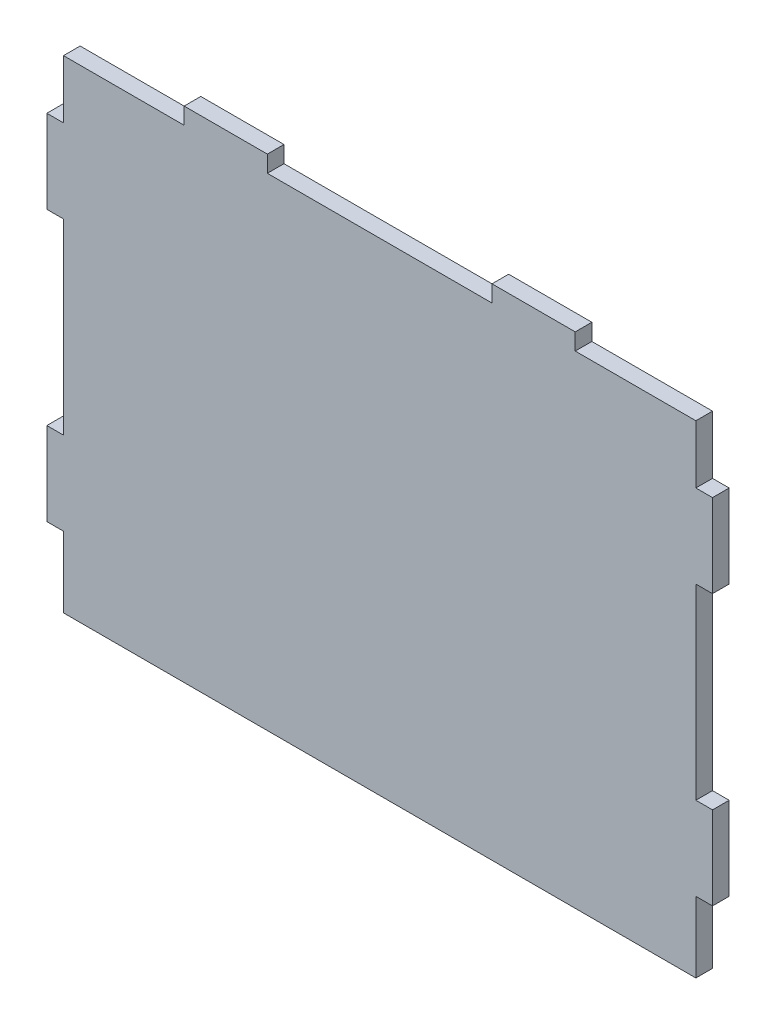
ISO-10303-21;
HEADER;
FILE_DESCRIPTION(('STEP AP214'),'2;1');
FILE_NAME('part.step','',(''),(''),'','','');
FILE_SCHEMA(('AUTOMOTIVE_DESIGN { 1 0 10303 214 1 1 1 1 }'));
ENDSEC;
DATA;
#1=APPLICATION_CONTEXT('core data for automotive mechanical design processes');
#2=APPLICATION_PROTOCOL_DEFINITION('international standard','automotive_design',2000,#1);
#3=PRODUCT_CONTEXT('',#1,'mechanical');
#4=PRODUCT('Part','Part','',(#3));
#5=PRODUCT_RELATED_PRODUCT_CATEGORY('part','',(#4));
#6=PRODUCT_DEFINITION_FORMATION('','',#4);
#7=PRODUCT_DEFINITION_CONTEXT('part definition',#1,'design');
#8=PRODUCT_DEFINITION('design','',#6,#7);
#9=PRODUCT_DEFINITION_SHAPE('','',#8);
#10=(LENGTH_UNIT() NAMED_UNIT(*) SI_UNIT(.MILLI.,.METRE.));
#11=(NAMED_UNIT(*) PLANE_ANGLE_UNIT() SI_UNIT($,.RADIAN.));
#12=(NAMED_UNIT(*) SI_UNIT($,.STERADIAN.) SOLID_ANGLE_UNIT());
#13=UNCERTAINTY_MEASURE_WITH_UNIT(LENGTH_MEASURE(1.E-05),#10,'distance_accuracy_value','');
#14=(GEOMETRIC_REPRESENTATION_CONTEXT(3) GLOBAL_UNCERTAINTY_ASSIGNED_CONTEXT((#13)) GLOBAL_UNIT_ASSIGNED_CONTEXT((#10,
#11,#12)) REPRESENTATION_CONTEXT('',''));
#15=CARTESIAN_POINT('',(0.,0.,0.));
#16=DIRECTION('',(0.,0.,1.));
#17=DIRECTION('',(1.,0.,0.));
#18=AXIS2_PLACEMENT_3D('',#15,#16,#17);
#19=CARTESIAN_POINT('',(96.5200000000001,0.,5.08));
#20=DIRECTION('',(1.,0.,0.));
#21=DIRECTION('',(0.,1.,0.));
#22=AXIS2_PLACEMENT_3D('',#19,#20,#21);
#23=PLANE('',#22);
#24=DIRECTION('',(0.,-1.,0.));
#25=VECTOR('',#24,1.);
#26=CARTESIAN_POINT('',(96.5200000000001,0.,0.));
#27=LINE('',#26,#25);
#28=CARTESIAN_POINT('',(96.52,96.5200000000001,0.));
#29=VERTEX_POINT('',#28);
#30=CARTESIAN_POINT('',(96.52,78.74,0.));
#31=VERTEX_POINT('',#30);
#32=EDGE_CURVE('E247',#29,#31,#27,.T.);
#33=ORIENTED_EDGE('',*,*,#32,.F.);
#34=DIRECTION('',(0.,0.,-1.));
#35=VECTOR('',#34,1.);
#36=CARTESIAN_POINT('',(96.52,96.5200000000001,5.08));
#37=LINE('',#36,#35);
#38=CARTESIAN_POINT('',(96.52,96.5200000000001,5.08));
#39=VERTEX_POINT('',#38);
#40=EDGE_CURVE('E11',#39,#29,#37,.T.);
#41=ORIENTED_EDGE('',*,*,#40,.F.);
#42=DIRECTION('',(0.,-1.,0.));
#43=VECTOR('',#42,1.);
#44=CARTESIAN_POINT('',(96.5200000000001,0.,5.08));
#45=LINE('',#44,#43);
#46=CARTESIAN_POINT('',(96.52,78.74,5.08));
#47=VERTEX_POINT('',#46);
#48=EDGE_CURVE('E313',#39,#47,#45,.T.);
#49=ORIENTED_EDGE('',*,*,#48,.T.);
#50=DIRECTION('',(0.,0.,-1.));
#51=VECTOR('',#50,1.);
#52=CARTESIAN_POINT('',(96.52,78.74,5.08));
#53=LINE('',#52,#51);
#54=EDGE_CURVE('E145',#47,#31,#53,.T.);
#55=ORIENTED_EDGE('',*,*,#54,.T.);
#56=EDGE_LOOP('',(#33,#41,#49,#55));
#57=FACE_BOUND('',#56,.T.);
#58=ADVANCED_FACE('F34',(#57),#23,.T.);
#59=CARTESIAN_POINT('',(0.,96.5200000000001,5.08));
#60=DIRECTION('',(0.,1.,0.));
#61=DIRECTION('',(-1.,0.,0.));
#62=AXIS2_PLACEMENT_3D('',#59,#60,#61);
#63=PLANE('',#62);
#64=DIRECTION('',(1.,0.,0.));
#65=VECTOR('',#64,1.);
#66=CARTESIAN_POINT('',(0.,96.5200000000001,0.));
#67=LINE('',#66,#65);
#68=CARTESIAN_POINT('',(59.69,96.5200000000001,0.));
#69=VERTEX_POINT('',#68);
#70=EDGE_CURVE('E250',#69,#29,#67,.T.);
#71=ORIENTED_EDGE('',*,*,#70,.F.);
#72=DIRECTION('',(0.,0.,-1.));
#73=VECTOR('',#72,1.);
#74=CARTESIAN_POINT('',(59.69,96.5200000000001,5.08));
#75=LINE('',#74,#73);
#76=CARTESIAN_POINT('',(59.69,96.5200000000001,5.08));
#77=VERTEX_POINT('',#76);
#78=EDGE_CURVE('E43',#77,#69,#75,.T.);
#79=ORIENTED_EDGE('',*,*,#78,.F.);
#80=DIRECTION('',(1.,0.,0.));
#81=VECTOR('',#80,1.);
#82=CARTESIAN_POINT('',(0.,96.5200000000001,5.08));
#83=LINE('',#82,#81);
#84=EDGE_CURVE('E384',#77,#39,#83,.T.);
#85=ORIENTED_EDGE('',*,*,#84,.T.);
#86=ORIENTED_EDGE('',*,*,#40,.T.);
#87=EDGE_LOOP('',(#71,#79,#85,#86));
#88=FACE_BOUND('',#87,.T.);
#89=ADVANCED_FACE('F372',(#88),#63,.T.);
#90=CARTESIAN_POINT('',(59.69,0.,5.08));
#91=DIRECTION('',(1.,0.,0.));
#92=DIRECTION('',(0.,0.,-1.));
#93=AXIS2_PLACEMENT_3D('',#90,#91,#92);
#94=PLANE('',#93);
#95=DIRECTION('',(0.,-1.,0.));
#96=VECTOR('',#95,1.);
#97=CARTESIAN_POINT('',(59.69,0.,0.));
#98=LINE('',#97,#96);
#99=CARTESIAN_POINT('',(59.69,101.6,0.));
#100=VERTEX_POINT('',#99);
#101=EDGE_CURVE('E255',#100,#69,#98,.T.);
#102=ORIENTED_EDGE('',*,*,#101,.F.);
#103=DIRECTION('',(0.,0.,-1.));
#104=VECTOR('',#103,1.);
#105=CARTESIAN_POINT('',(59.69,101.6,5.08));
#106=LINE('',#105,#104);
#107=CARTESIAN_POINT('',(59.69,101.6,5.08));
#108=VERTEX_POINT('',#107);
#109=EDGE_CURVE('E362',#108,#100,#106,.T.);
#110=ORIENTED_EDGE('',*,*,#109,.F.);
#111=DIRECTION('',(0.,-1.,0.));
#112=VECTOR('',#111,1.);
#113=CARTESIAN_POINT('',(59.69,0.,5.08));
#114=LINE('',#113,#112);
#115=EDGE_CURVE('E368',#108,#77,#114,.T.);
#116=ORIENTED_EDGE('',*,*,#115,.T.);
#117=ORIENTED_EDGE('',*,*,#78,.T.);
#118=EDGE_LOOP('',(#102,#110,#116,#117));
#119=FACE_BOUND('',#118,.T.);
#120=ADVANCED_FACE('F36',(#119),#94,.T.);
#121=CARTESIAN_POINT('',(0.,101.6,5.08));
#122=DIRECTION('',(0.,1.,0.));
#123=DIRECTION('',(0.,0.,1.));
#124=AXIS2_PLACEMENT_3D('',#121,#122,#123);
#125=PLANE('',#124);
#126=DIRECTION('',(1.,0.,0.));
#127=VECTOR('',#126,1.);
#128=CARTESIAN_POINT('',(0.,101.6,0.));
#129=LINE('',#128,#127);
#130=CARTESIAN_POINT('',(34.29,101.6,0.));
#131=VERTEX_POINT('',#130);
#132=EDGE_CURVE('E260',#131,#100,#129,.T.);
#133=ORIENTED_EDGE('',*,*,#132,.F.);
#134=DIRECTION('',(0.,0.,-1.));
#135=VECTOR('',#134,1.);
#136=CARTESIAN_POINT('',(34.29,101.6,5.08));
#137=LINE('',#136,#135);
#138=CARTESIAN_POINT('',(34.29,101.6,5.08));
#139=VERTEX_POINT('',#138);
#140=EDGE_CURVE('E360',#139,#131,#137,.T.);
#141=ORIENTED_EDGE('',*,*,#140,.F.);
#142=DIRECTION('',(1.,0.,0.));
#143=VECTOR('',#142,1.);
#144=CARTESIAN_POINT('',(0.,101.6,5.08));
#145=LINE('',#144,#143);
#146=EDGE_CURVE('E383',#139,#108,#145,.T.);
#147=ORIENTED_EDGE('',*,*,#146,.T.);
#148=ORIENTED_EDGE('',*,*,#109,.T.);
#149=EDGE_LOOP('',(#133,#141,#147,#148));
#150=FACE_BOUND('',#149,.T.);
#151=ADVANCED_FACE('F379',(#150),#125,.T.);
#152=CARTESIAN_POINT('',(34.29,0.,5.08));
#153=DIRECTION('',(1.,0.,0.));
#154=DIRECTION('',(0.,0.,-1.));
#155=AXIS2_PLACEMENT_3D('',#152,#153,#154);
#156=PLANE('',#155);
#157=DIRECTION('',(0.,-1.,0.));
#158=VECTOR('',#157,1.);
#159=CARTESIAN_POINT('',(34.29,0.,0.));
#160=LINE('',#159,#158);
#161=CARTESIAN_POINT('',(34.29,96.5200000000001,0.));
#162=VERTEX_POINT('',#161);
#163=EDGE_CURVE('E263',#131,#162,#160,.T.);
#164=ORIENTED_EDGE('',*,*,#163,.T.);
#165=DIRECTION('',(0.,0.,-1.));
#166=VECTOR('',#165,1.);
#167=CARTESIAN_POINT('',(34.29,96.5200000000001,5.08));
#168=LINE('',#167,#166);
#169=CARTESIAN_POINT('',(34.29,96.5200000000001,5.08));
#170=VERTEX_POINT('',#169);
#171=EDGE_CURVE('E358',#170,#162,#168,.T.);
#172=ORIENTED_EDGE('',*,*,#171,.F.);
#173=DIRECTION('',(0.,-1.,0.));
#174=VECTOR('',#173,1.);
#175=CARTESIAN_POINT('',(34.29,0.,5.08));
#176=LINE('',#175,#174);
#177=EDGE_CURVE('E386',#139,#170,#176,.T.);
#178=ORIENTED_EDGE('',*,*,#177,.F.);
#179=ORIENTED_EDGE('',*,*,#140,.T.);
#180=EDGE_LOOP('',(#164,#172,#178,#179));
#181=FACE_BOUND('',#180,.T.);
#182=ADVANCED_FACE('F689',(#181),#156,.F.);
#183=CARTESIAN_POINT('',(-34.29,96.5200000000001,0.));
#184=VERTEX_POINT('',#183);
#185=EDGE_CURVE('E257',#184,#162,#67,.T.);
#186=ORIENTED_EDGE('',*,*,#185,.F.);
#187=DIRECTION('',(0.,0.,-1.));
#188=VECTOR('',#187,1.);
#189=CARTESIAN_POINT('',(-34.29,96.5200000000001,5.08));
#190=LINE('',#189,#188);
#191=CARTESIAN_POINT('',(-34.29,96.5200000000001,5.08));
#192=VERTEX_POINT('',#191);
#193=EDGE_CURVE('E356',#192,#184,#190,.T.);
#194=ORIENTED_EDGE('',*,*,#193,.F.);
#195=EDGE_CURVE('E390',#192,#170,#83,.T.);
#196=ORIENTED_EDGE('',*,*,#195,.T.);
#197=ORIENTED_EDGE('',*,*,#171,.T.);
#198=EDGE_LOOP('',(#186,#194,#196,#197));
#199=FACE_BOUND('',#198,.T.);
#200=ADVANCED_FACE('F444',(#199),#63,.T.);
#201=CARTESIAN_POINT('',(-34.29,0.,5.08));
#202=DIRECTION('',(1.,0.,0.));
#203=DIRECTION('',(0.,0.,-1.));
#204=AXIS2_PLACEMENT_3D('',#201,#202,#203);
#205=PLANE('',#204);
#206=DIRECTION('',(0.,-1.,0.));
#207=VECTOR('',#206,1.);
#208=CARTESIAN_POINT('',(-34.29,0.,0.));
#209=LINE('',#208,#207);
#210=CARTESIAN_POINT('',(-34.29,101.6,0.));
#211=VERTEX_POINT('',#210);
#212=EDGE_CURVE('E266',#211,#184,#209,.T.);
#213=ORIENTED_EDGE('',*,*,#212,.F.);
#214=DIRECTION('',(0.,0.,-1.));
#215=VECTOR('',#214,1.);
#216=CARTESIAN_POINT('',(-34.29,101.6,5.08));
#217=LINE('',#216,#215);
#218=CARTESIAN_POINT('',(-34.29,101.6,5.08));
#219=VERTEX_POINT('',#218);
#220=EDGE_CURVE('E354',#219,#211,#217,.T.);
#221=ORIENTED_EDGE('',*,*,#220,.F.);
#222=DIRECTION('',(0.,-1.,0.));
#223=VECTOR('',#222,1.);
#224=CARTESIAN_POINT('',(-34.29,0.,5.08));
#225=LINE('',#224,#223);
#226=EDGE_CURVE('E394',#219,#192,#225,.T.);
#227=ORIENTED_EDGE('',*,*,#226,.T.);
#228=ORIENTED_EDGE('',*,*,#193,.T.);
#229=EDGE_LOOP('',(#213,#221,#227,#228));
#230=FACE_BOUND('',#229,.T.);
#231=ADVANCED_FACE('F670',(#230),#205,.T.);
#232=CARTESIAN_POINT('',(0.,101.6,5.08));
#233=DIRECTION('',(0.,1.,0.));
#234=DIRECTION('',(0.,0.,1.));
#235=AXIS2_PLACEMENT_3D('',#232,#233,#234);
#236=PLANE('',#235);
#237=DIRECTION('',(1.,0.,0.));
#238=VECTOR('',#237,1.);
#239=CARTESIAN_POINT('',(0.,101.6,0.));
#240=LINE('',#239,#238);
#241=CARTESIAN_POINT('',(-59.69,101.6,0.));
#242=VERTEX_POINT('',#241);
#243=EDGE_CURVE('E269',#242,#211,#240,.T.);
#244=ORIENTED_EDGE('',*,*,#243,.F.);
#245=DIRECTION('',(0.,0.,-1.));
#246=VECTOR('',#245,1.);
#247=CARTESIAN_POINT('',(-59.69,101.6,5.08));
#248=LINE('',#247,#246);
#249=CARTESIAN_POINT('',(-59.69,101.6,5.08));
#250=VERTEX_POINT('',#249);
#251=EDGE_CURVE('E352',#250,#242,#248,.T.);
#252=ORIENTED_EDGE('',*,*,#251,.F.);
#253=DIRECTION('',(1.,0.,0.));
#254=VECTOR('',#253,1.);
#255=CARTESIAN_POINT('',(0.,101.6,5.08));
#256=LINE('',#255,#254);
#257=EDGE_CURVE('E397',#250,#219,#256,.T.);
#258=ORIENTED_EDGE('',*,*,#257,.T.);
#259=ORIENTED_EDGE('',*,*,#220,.T.);
#260=EDGE_LOOP('',(#244,#252,#258,#259));
#261=FACE_BOUND('',#260,.T.);
#262=ADVANCED_FACE('F659',(#261),#236,.T.);
#263=CARTESIAN_POINT('',(-59.69,0.,5.08));
#264=DIRECTION('',(1.,0.,0.));
#265=DIRECTION('',(0.,0.,-1.));
#266=AXIS2_PLACEMENT_3D('',#263,#264,#265);
#267=PLANE('',#266);
#268=DIRECTION('',(0.,-1.,0.));
#269=VECTOR('',#268,1.);
#270=CARTESIAN_POINT('',(-59.69,0.,0.));
#271=LINE('',#270,#269);
#272=CARTESIAN_POINT('',(-59.69,96.5200000000001,0.));
#273=VERTEX_POINT('',#272);
#274=EDGE_CURVE('E272',#242,#273,#271,.T.);
#275=ORIENTED_EDGE('',*,*,#274,.T.);
#276=DIRECTION('',(0.,0.,-1.));
#277=VECTOR('',#276,1.);
#278=CARTESIAN_POINT('',(-59.69,96.5200000000001,5.08));
#279=LINE('',#278,#277);
#280=CARTESIAN_POINT('',(-59.69,96.5200000000001,5.08));
#281=VERTEX_POINT('',#280);
#282=EDGE_CURVE('E350',#281,#273,#279,.T.);
#283=ORIENTED_EDGE('',*,*,#282,.F.);
#284=DIRECTION('',(0.,-1.,0.));
#285=VECTOR('',#284,1.);
#286=CARTESIAN_POINT('',(-59.69,0.,5.08));
#287=LINE('',#286,#285);
#288=EDGE_CURVE('E400',#250,#281,#287,.T.);
#289=ORIENTED_EDGE('',*,*,#288,.F.);
#290=ORIENTED_EDGE('',*,*,#251,.T.);
#291=EDGE_LOOP('',(#275,#283,#289,#290));
#292=FACE_BOUND('',#291,.T.);
#293=ADVANCED_FACE('F648',(#292),#267,.F.);
#294=CARTESIAN_POINT('',(-96.52,96.5200000000001,0.));
#295=VERTEX_POINT('',#294);
#296=EDGE_CURVE('E256',#295,#273,#67,.T.);
#297=ORIENTED_EDGE('',*,*,#296,.F.);
#298=DIRECTION('',(0.,0.,-1.));
#299=VECTOR('',#298,1.);
#300=CARTESIAN_POINT('',(-96.52,96.5200000000001,5.08));
#301=LINE('',#300,#299);
#302=CARTESIAN_POINT('',(-96.52,96.5200000000001,5.08));
#303=VERTEX_POINT('',#302);
#304=EDGE_CURVE('E348',#303,#295,#301,.T.);
#305=ORIENTED_EDGE('',*,*,#304,.F.);
#306=EDGE_CURVE('E389',#303,#281,#83,.T.);
#307=ORIENTED_EDGE('',*,*,#306,.T.);
#308=ORIENTED_EDGE('',*,*,#282,.T.);
#309=EDGE_LOOP('',(#297,#305,#307,#308));
#310=FACE_BOUND('',#309,.T.);
#311=ADVANCED_FACE('F445',(#310),#63,.T.);
#312=CARTESIAN_POINT('',(-96.52,0.,5.08));
#313=DIRECTION('',(1.,0.,0.));
#314=DIRECTION('',(0.,1.,0.));
#315=AXIS2_PLACEMENT_3D('',#312,#313,#314);
#316=PLANE('',#315);
#317=DIRECTION('',(0.,-1.,0.));
#318=VECTOR('',#317,1.);
#319=CARTESIAN_POINT('',(-96.52,0.,0.));
#320=LINE('',#319,#318);
#321=CARTESIAN_POINT('',(-96.52,78.74,0.));
#322=VERTEX_POINT('',#321);
#323=EDGE_CURVE('E275',#295,#322,#320,.T.);
#324=ORIENTED_EDGE('',*,*,#323,.T.);
#325=DIRECTION('',(0.,0.,-1.));
#326=VECTOR('',#325,1.);
#327=CARTESIAN_POINT('',(-96.52,78.74,5.08));
#328=LINE('',#327,#326);
#329=CARTESIAN_POINT('',(-96.52,78.74,5.08));
#330=VERTEX_POINT('',#329);
#331=EDGE_CURVE('E346',#330,#322,#328,.T.);
#332=ORIENTED_EDGE('',*,*,#331,.F.);
#333=DIRECTION('',(0.,-1.,0.));
#334=VECTOR('',#333,1.);
#335=CARTESIAN_POINT('',(-96.52,0.,5.08));
#336=LINE('',#335,#334);
#337=EDGE_CURVE('E402',#303,#330,#336,.T.);
#338=ORIENTED_EDGE('',*,*,#337,.F.);
#339=ORIENTED_EDGE('',*,*,#304,.T.);
#340=EDGE_LOOP('',(#324,#332,#338,#339));
#341=FACE_BOUND('',#340,.T.);
#342=ADVANCED_FACE('F559',(#341),#316,.F.);
#343=CARTESIAN_POINT('',(0.,78.74,5.08));
#344=DIRECTION('',(0.,1.,0.));
#345=DIRECTION('',(0.,0.,1.));
#346=AXIS2_PLACEMENT_3D('',#343,#344,#345);
#347=PLANE('',#346);
#348=DIRECTION('',(1.,0.,0.));
#349=VECTOR('',#348,1.);
#350=CARTESIAN_POINT('',(0.,78.74,0.));
#351=LINE('',#350,#349);
#352=CARTESIAN_POINT('',(-101.6,78.74,0.));
#353=VERTEX_POINT('',#352);
#354=EDGE_CURVE('E278',#353,#322,#351,.T.);
#355=ORIENTED_EDGE('',*,*,#354,.F.);
#356=DIRECTION('',(0.,0.,-1.));
#357=VECTOR('',#356,1.);
#358=CARTESIAN_POINT('',(-101.6,78.74,5.08));
#359=LINE('',#358,#357);
#360=CARTESIAN_POINT('',(-101.6,78.74,5.08));
#361=VERTEX_POINT('',#360);
#362=EDGE_CURVE('E344',#361,#353,#359,.T.);
#363=ORIENTED_EDGE('',*,*,#362,.F.);
#364=DIRECTION('',(1.,0.,0.));
#365=VECTOR('',#364,1.);
#366=CARTESIAN_POINT('',(0.,78.74,5.08));
#367=LINE('',#366,#365);
#368=EDGE_CURVE('E404',#361,#330,#367,.T.);
#369=ORIENTED_EDGE('',*,*,#368,.T.);
#370=ORIENTED_EDGE('',*,*,#331,.T.);
#371=EDGE_LOOP('',(#355,#363,#369,#370));
#372=FACE_BOUND('',#371,.T.);
#373=ADVANCED_FACE('F620',(#372),#347,.T.);
#374=CARTESIAN_POINT('',(-101.6,0.,5.08));
#375=DIRECTION('',(-1.,0.,0.));
#376=DIRECTION('',(0.,0.,1.));
#377=AXIS2_PLACEMENT_3D('',#374,#375,#376);
#378=PLANE('',#377);
#379=DIRECTION('',(0.,1.,0.));
#380=VECTOR('',#379,1.);
#381=CARTESIAN_POINT('',(-101.6,0.,0.));
#382=LINE('',#381,#380);
#383=CARTESIAN_POINT('',(-101.6,53.34,0.));
#384=VERTEX_POINT('',#383);
#385=EDGE_CURVE('E283',#384,#353,#382,.T.);
#386=ORIENTED_EDGE('',*,*,#385,.F.);
#387=DIRECTION('',(0.,0.,-1.));
#388=VECTOR('',#387,1.);
#389=CARTESIAN_POINT('',(-101.6,53.34,5.08));
#390=LINE('',#389,#388);
#391=CARTESIAN_POINT('',(-101.6,53.34,5.08));
#392=VERTEX_POINT('',#391);
#393=EDGE_CURVE('E342',#392,#384,#390,.T.);
#394=ORIENTED_EDGE('',*,*,#393,.F.);
#395=DIRECTION('',(0.,1.,0.));
#396=VECTOR('',#395,1.);
#397=CARTESIAN_POINT('',(-101.6,0.,5.08));
#398=LINE('',#397,#396);
#399=EDGE_CURVE('E409',#392,#361,#398,.T.);
#400=ORIENTED_EDGE('',*,*,#399,.T.);
#401=ORIENTED_EDGE('',*,*,#362,.T.);
#402=EDGE_LOOP('',(#386,#394,#400,#401));
#403=FACE_BOUND('',#402,.T.);
#404=ADVANCED_FACE('F609',(#403),#378,.T.);
#405=CARTESIAN_POINT('',(0.,53.34,5.08));
#406=DIRECTION('',(0.,1.,0.));
#407=DIRECTION('',(0.,0.,1.));
#408=AXIS2_PLACEMENT_3D('',#405,#406,#407);
#409=PLANE('',#408);
#410=DIRECTION('',(1.,0.,0.));
#411=VECTOR('',#410,1.);
#412=CARTESIAN_POINT('',(0.,53.34,0.));
#413=LINE('',#412,#411);
#414=CARTESIAN_POINT('',(-96.52,53.34,0.));
#415=VERTEX_POINT('',#414);
#416=EDGE_CURVE('E286',#384,#415,#413,.T.);
#417=ORIENTED_EDGE('',*,*,#416,.T.);
#418=DIRECTION('',(0.,0.,-1.));
#419=VECTOR('',#418,1.);
#420=CARTESIAN_POINT('',(-96.52,53.34,5.08));
#421=LINE('',#420,#419);
#422=CARTESIAN_POINT('',(-96.52,53.34,5.08));
#423=VERTEX_POINT('',#422);
#424=EDGE_CURVE('E339',#423,#415,#421,.T.);
#425=ORIENTED_EDGE('',*,*,#424,.F.);
#426=DIRECTION('',(1.,0.,0.));
#427=VECTOR('',#426,1.);
#428=CARTESIAN_POINT('',(0.,53.34,5.08));
#429=LINE('',#428,#427);
#430=EDGE_CURVE('E412',#392,#423,#429,.T.);
#431=ORIENTED_EDGE('',*,*,#430,.F.);
#432=ORIENTED_EDGE('',*,*,#393,.T.);
#433=EDGE_LOOP('',(#417,#425,#431,#432));
#434=FACE_BOUND('',#433,.T.);
#435=ADVANCED_FACE('F599',(#434),#409,.F.);
#436=CARTESIAN_POINT('',(-96.52,-3.81000000000001,0.));
#437=VERTEX_POINT('',#436);
#438=EDGE_CURVE('E280',#415,#437,#320,.T.);
#439=ORIENTED_EDGE('',*,*,#438,.T.);
#440=DIRECTION('',(0.,0.,-1.));
#441=VECTOR('',#440,1.);
#442=CARTESIAN_POINT('',(-96.52,-3.81000000000001,5.08));
#443=LINE('',#442,#441);
#444=CARTESIAN_POINT('',(-96.52,-3.81000000000001,5.08));
#445=VERTEX_POINT('',#444);
#446=EDGE_CURVE('E337',#445,#437,#443,.T.);
#447=ORIENTED_EDGE('',*,*,#446,.F.);
#448=EDGE_CURVE('E406',#423,#445,#336,.T.);
#449=ORIENTED_EDGE('',*,*,#448,.F.);
#450=ORIENTED_EDGE('',*,*,#424,.T.);
#451=EDGE_LOOP('',(#439,#447,#449,#450));
#452=FACE_BOUND('',#451,.T.);
#453=ADVANCED_FACE('F560',(#452),#316,.F.);
#454=CARTESIAN_POINT('',(0.,-3.81000000000001,5.08));
#455=DIRECTION('',(0.,1.,0.));
#456=DIRECTION('',(0.,0.,1.));
#457=AXIS2_PLACEMENT_3D('',#454,#455,#456);
#458=PLANE('',#457);
#459=DIRECTION('',(1.,0.,0.));
#460=VECTOR('',#459,1.);
#461=CARTESIAN_POINT('',(0.,-3.81000000000001,0.));
#462=LINE('',#461,#460);
#463=CARTESIAN_POINT('',(-101.6,-3.81000000000001,0.));
#464=VERTEX_POINT('',#463);
#465=EDGE_CURVE('E288',#464,#437,#462,.T.);
#466=ORIENTED_EDGE('',*,*,#465,.F.);
#467=DIRECTION('',(0.,0.,-1.));
#468=VECTOR('',#467,1.);
#469=CARTESIAN_POINT('',(-101.6,-3.81000000000001,5.08));
#470=LINE('',#469,#468);
#471=CARTESIAN_POINT('',(-101.6,-3.81000000000001,5.08));
#472=VERTEX_POINT('',#471);
#473=EDGE_CURVE('E335',#472,#464,#470,.T.);
#474=ORIENTED_EDGE('',*,*,#473,.F.);
#475=DIRECTION('',(1.,0.,0.));
#476=VECTOR('',#475,1.);
#477=CARTESIAN_POINT('',(0.,-3.81000000000001,5.08));
#478=LINE('',#477,#476);
#479=EDGE_CURVE('E414',#472,#445,#478,.T.);
#480=ORIENTED_EDGE('',*,*,#479,.T.);
#481=ORIENTED_EDGE('',*,*,#446,.T.);
#482=EDGE_LOOP('',(#466,#474,#480,#481));
#483=FACE_BOUND('',#482,.T.);
#484=ADVANCED_FACE('F580',(#483),#458,.T.);
#485=CARTESIAN_POINT('',(-101.6,0.,5.08));
#486=DIRECTION('',(-1.,0.,0.));
#487=DIRECTION('',(0.,0.,1.));
#488=AXIS2_PLACEMENT_3D('',#485,#486,#487);
#489=PLANE('',#488);
#490=DIRECTION('',(0.,1.,0.));
#491=VECTOR('',#490,1.);
#492=CARTESIAN_POINT('',(-101.6,0.,0.));
#493=LINE('',#492,#491);
#494=CARTESIAN_POINT('',(-101.6,-29.21,0.));
#495=VERTEX_POINT('',#494);
#496=EDGE_CURVE('E291',#495,#464,#493,.T.);
#497=ORIENTED_EDGE('',*,*,#496,.F.);
#498=DIRECTION('',(0.,0.,-1.));
#499=VECTOR('',#498,1.);
#500=CARTESIAN_POINT('',(-101.6,-29.21,5.08));
#501=LINE('',#500,#499);
#502=CARTESIAN_POINT('',(-101.6,-29.21,5.08));
#503=VERTEX_POINT('',#502);
#504=EDGE_CURVE('E333',#503,#495,#501,.T.);
#505=ORIENTED_EDGE('',*,*,#504,.F.);
#506=DIRECTION('',(0.,1.,0.));
#507=VECTOR('',#506,1.);
#508=CARTESIAN_POINT('',(-101.6,0.,5.08));
#509=LINE('',#508,#507);
#510=EDGE_CURVE('E417',#503,#472,#509,.T.);
#511=ORIENTED_EDGE('',*,*,#510,.T.);
#512=ORIENTED_EDGE('',*,*,#473,.T.);
#513=EDGE_LOOP('',(#497,#505,#511,#512));
#514=FACE_BOUND('',#513,.T.);
#515=ADVANCED_FACE('F569',(#514),#489,.T.);
#516=CARTESIAN_POINT('',(0.,-29.21,5.08));
#517=DIRECTION('',(0.,1.,0.));
#518=DIRECTION('',(0.,0.,1.));
#519=AXIS2_PLACEMENT_3D('',#516,#517,#518);
#520=PLANE('',#519);
#521=DIRECTION('',(1.,0.,0.));
#522=VECTOR('',#521,1.);
#523=CARTESIAN_POINT('',(0.,-29.21,0.));
#524=LINE('',#523,#522);
#525=CARTESIAN_POINT('',(-96.52,-29.21,0.));
#526=VERTEX_POINT('',#525);
#527=EDGE_CURVE('E294',#495,#526,#524,.T.);
#528=ORIENTED_EDGE('',*,*,#527,.T.);
#529=DIRECTION('',(0.,0.,-1.));
#530=VECTOR('',#529,1.);
#531=CARTESIAN_POINT('',(-96.52,-29.21,5.08));
#532=LINE('',#531,#530);
#533=CARTESIAN_POINT('',(-96.52,-29.21,5.08));
#534=VERTEX_POINT('',#533);
#535=EDGE_CURVE('E330',#534,#526,#532,.T.);
#536=ORIENTED_EDGE('',*,*,#535,.F.);
#537=DIRECTION('',(1.,0.,0.));
#538=VECTOR('',#537,1.);
#539=CARTESIAN_POINT('',(0.,-29.21,5.08));
#540=LINE('',#539,#538);
#541=EDGE_CURVE('E420',#503,#534,#540,.T.);
#542=ORIENTED_EDGE('',*,*,#541,.F.);
#543=ORIENTED_EDGE('',*,*,#504,.T.);
#544=EDGE_LOOP('',(#528,#536,#542,#543));
#545=FACE_BOUND('',#544,.T.);
#546=ADVANCED_FACE('F556',(#545),#520,.F.);
#547=CARTESIAN_POINT('',(-96.52,-50.8,0.));
#548=VERTEX_POINT('',#547);
#549=EDGE_CURVE('E279',#526,#548,#320,.T.);
#550=ORIENTED_EDGE('',*,*,#549,.T.);
#551=DIRECTION('',(0.,0.,-1.));
#552=VECTOR('',#551,1.);
#553=CARTESIAN_POINT('',(-96.52,-50.8,5.08));
#554=LINE('',#553,#552);
#555=CARTESIAN_POINT('',(-96.52,-50.8,5.08));
#556=VERTEX_POINT('',#555);
#557=EDGE_CURVE('E327',#556,#548,#554,.T.);
#558=ORIENTED_EDGE('',*,*,#557,.F.);
#559=EDGE_CURVE('E405',#534,#556,#336,.T.);
#560=ORIENTED_EDGE('',*,*,#559,.F.);
#561=ORIENTED_EDGE('',*,*,#535,.T.);
#562=EDGE_LOOP('',(#550,#558,#560,#561));
#563=FACE_BOUND('',#562,.T.);
#564=ADVANCED_FACE('F545',(#563),#316,.F.);
#565=CARTESIAN_POINT('',(0.,-50.8,5.08));
#566=DIRECTION('',(0.,1.,0.));
#567=DIRECTION('',(-1.,0.,0.));
#568=AXIS2_PLACEMENT_3D('',#565,#566,#567);
#569=PLANE('',#568);
#570=DIRECTION('',(1.,0.,0.));
#571=VECTOR('',#570,1.);
#572=CARTESIAN_POINT('',(0.,-50.8,0.));
#573=LINE('',#572,#571);
#574=CARTESIAN_POINT('',(96.5200000000001,-50.8,0.));
#575=VERTEX_POINT('',#574);
#576=EDGE_CURVE('E296',#548,#575,#573,.T.);
#577=ORIENTED_EDGE('',*,*,#576,.T.);
#578=DIRECTION('',(0.,0.,-1.));
#579=VECTOR('',#578,1.);
#580=CARTESIAN_POINT('',(96.5200000000001,-50.8,5.08));
#581=LINE('',#580,#579);
#582=CARTESIAN_POINT('',(96.5200000000001,-50.8,5.08));
#583=VERTEX_POINT('',#582);
#584=EDGE_CURVE('E325',#583,#575,#581,.T.);
#585=ORIENTED_EDGE('',*,*,#584,.F.);
#586=DIRECTION('',(1.,0.,0.));
#587=VECTOR('',#586,1.);
#588=CARTESIAN_POINT('',(0.,-50.8,5.08));
#589=LINE('',#588,#587);
#590=EDGE_CURVE('E422',#556,#583,#589,.T.);
#591=ORIENTED_EDGE('',*,*,#590,.F.);
#592=ORIENTED_EDGE('',*,*,#557,.T.);
#593=EDGE_LOOP('',(#577,#585,#591,#592));
#594=FACE_BOUND('',#593,.T.);
#595=ADVANCED_FACE('F450',(#594),#569,.F.);
#596=CARTESIAN_POINT('',(96.5200000000001,-29.21,0.));
#597=VERTEX_POINT('',#596);
#598=EDGE_CURVE('E252',#597,#575,#27,.T.);
#599=ORIENTED_EDGE('',*,*,#598,.F.);
#600=DIRECTION('',(0.,0.,-1.));
#601=VECTOR('',#600,1.);
#602=CARTESIAN_POINT('',(96.5200000000001,-29.21,5.08));
#603=LINE('',#602,#601);
#604=CARTESIAN_POINT('',(96.5200000000001,-29.21,5.08));
#605=VERTEX_POINT('',#604);
#606=EDGE_CURVE('E323',#605,#597,#603,.T.);
#607=ORIENTED_EDGE('',*,*,#606,.F.);
#608=EDGE_CURVE('E424',#605,#583,#45,.T.);
#609=ORIENTED_EDGE('',*,*,#608,.T.);
#610=ORIENTED_EDGE('',*,*,#584,.T.);
#611=EDGE_LOOP('',(#599,#607,#609,#610));
#612=FACE_BOUND('',#611,.T.);
#613=ADVANCED_FACE('F438',(#612),#23,.T.);
#614=CARTESIAN_POINT('',(0.,-29.21,5.08));
#615=DIRECTION('',(0.,-1.,0.));
#616=DIRECTION('',(0.,0.,-1.));
#617=AXIS2_PLACEMENT_3D('',#614,#615,#616);
#618=PLANE('',#617);
#619=DIRECTION('',(-1.,0.,0.));
#620=VECTOR('',#619,1.);
#621=CARTESIAN_POINT('',(0.,-29.21,0.));
#622=LINE('',#621,#620);
#623=CARTESIAN_POINT('',(101.6,-29.21,0.));
#624=VERTEX_POINT('',#623);
#625=EDGE_CURVE('E299',#624,#597,#622,.T.);
#626=ORIENTED_EDGE('',*,*,#625,.F.);
#627=DIRECTION('',(0.,0.,-1.));
#628=VECTOR('',#627,1.);
#629=CARTESIAN_POINT('',(101.6,-29.21,5.08));
#630=LINE('',#629,#628);
#631=CARTESIAN_POINT('',(101.6,-29.21,5.08));
#632=VERTEX_POINT('',#631);
#633=EDGE_CURVE('E321',#632,#624,#630,.T.);
#634=ORIENTED_EDGE('',*,*,#633,.F.);
#635=DIRECTION('',(-1.,0.,0.));
#636=VECTOR('',#635,1.);
#637=CARTESIAN_POINT('',(0.,-29.21,5.08));
#638=LINE('',#637,#636);
#639=EDGE_CURVE('E425',#632,#605,#638,.T.);
#640=ORIENTED_EDGE('',*,*,#639,.T.);
#641=ORIENTED_EDGE('',*,*,#606,.T.);
#642=EDGE_LOOP('',(#626,#634,#640,#641));
#643=FACE_BOUND('',#642,.T.);
#644=ADVANCED_FACE('F449',(#643),#618,.T.);
#645=CARTESIAN_POINT('',(101.6,0.,5.08));
#646=DIRECTION('',(1.,0.,0.));
#647=DIRECTION('',(0.,1.,0.));
#648=AXIS2_PLACEMENT_3D('',#645,#646,#647);
#649=PLANE('',#648);
#650=DIRECTION('',(0.,-1.,0.));
#651=VECTOR('',#650,1.);
#652=CARTESIAN_POINT('',(101.6,0.,0.));
#653=LINE('',#652,#651);
#654=CARTESIAN_POINT('',(101.6,-3.81,0.));
#655=VERTEX_POINT('',#654);
#656=EDGE_CURVE('E302',#655,#624,#653,.T.);
#657=ORIENTED_EDGE('',*,*,#656,.F.);
#658=DIRECTION('',(0.,0.,-1.));
#659=VECTOR('',#658,1.);
#660=CARTESIAN_POINT('',(101.6,-3.81,5.08));
#661=LINE('',#660,#659);
#662=CARTESIAN_POINT('',(101.6,-3.81,5.08));
#663=VERTEX_POINT('',#662);
#664=EDGE_CURVE('E319',#663,#655,#661,.T.);
#665=ORIENTED_EDGE('',*,*,#664,.F.);
#666=DIRECTION('',(0.,-1.,0.));
#667=VECTOR('',#666,1.);
#668=CARTESIAN_POINT('',(101.6,0.,5.08));
#669=LINE('',#668,#667);
#670=EDGE_CURVE('E428',#663,#632,#669,.T.);
#671=ORIENTED_EDGE('',*,*,#670,.T.);
#672=ORIENTED_EDGE('',*,*,#633,.T.);
#673=EDGE_LOOP('',(#657,#665,#671,#672));
#674=FACE_BOUND('',#673,.T.);
#675=ADVANCED_FACE('F458',(#674),#649,.T.);
#676=CARTESIAN_POINT('',(0.,-3.81,5.08));
#677=DIRECTION('',(0.,-1.,0.));
#678=DIRECTION('',(0.,0.,-1.));
#679=AXIS2_PLACEMENT_3D('',#676,#677,#678);
#680=PLANE('',#679);
#681=DIRECTION('',(-1.,0.,0.));
#682=VECTOR('',#681,1.);
#683=CARTESIAN_POINT('',(0.,-3.81,0.));
#684=LINE('',#683,#682);
#685=CARTESIAN_POINT('',(96.5200000000001,-3.81,0.));
#686=VERTEX_POINT('',#685);
#687=EDGE_CURVE('E305',#655,#686,#684,.T.);
#688=ORIENTED_EDGE('',*,*,#687,.T.);
#689=DIRECTION('',(0.,0.,-1.));
#690=VECTOR('',#689,1.);
#691=CARTESIAN_POINT('',(96.5200000000001,-3.81,5.08));
#692=LINE('',#691,#690);
#693=CARTESIAN_POINT('',(96.5200000000001,-3.81,5.08));
#694=VERTEX_POINT('',#693);
#695=EDGE_CURVE('E317',#694,#686,#692,.T.);
#696=ORIENTED_EDGE('',*,*,#695,.F.);
#697=DIRECTION('',(-1.,0.,0.));
#698=VECTOR('',#697,1.);
#699=CARTESIAN_POINT('',(0.,-3.81,5.08));
#700=LINE('',#699,#698);
#701=EDGE_CURVE('E430',#663,#694,#700,.T.);
#702=ORIENTED_EDGE('',*,*,#701,.F.);
#703=ORIENTED_EDGE('',*,*,#664,.T.);
#704=EDGE_LOOP('',(#688,#696,#702,#703));
#705=FACE_BOUND('',#704,.T.);
#706=ADVANCED_FACE('F453',(#705),#680,.F.);
#707=CARTESIAN_POINT('',(96.5200000000001,53.34,0.));
#708=VERTEX_POINT('',#707);
#709=EDGE_CURVE('E251',#708,#686,#27,.T.);
#710=ORIENTED_EDGE('',*,*,#709,.F.);
#711=DIRECTION('',(0.,0.,-1.));
#712=VECTOR('',#711,1.);
#713=CARTESIAN_POINT('',(96.5200000000001,53.34,5.08));
#714=LINE('',#713,#712);
#715=CARTESIAN_POINT('',(96.5200000000001,53.34,5.08));
#716=VERTEX_POINT('',#715);
#717=EDGE_CURVE('E234',#716,#708,#714,.T.);
#718=ORIENTED_EDGE('',*,*,#717,.F.);
#719=EDGE_CURVE('E240',#716,#694,#45,.T.);
#720=ORIENTED_EDGE('',*,*,#719,.T.);
#721=ORIENTED_EDGE('',*,*,#695,.T.);
#722=EDGE_LOOP('',(#710,#718,#720,#721));
#723=FACE_BOUND('',#722,.T.);
#724=ADVANCED_FACE('F439',(#723),#23,.T.);
#725=CARTESIAN_POINT('',(0.,53.34,5.08));
#726=DIRECTION('',(0.,-1.,0.));
#727=DIRECTION('',(0.,0.,-1.));
#728=AXIS2_PLACEMENT_3D('',#725,#726,#727);
#729=PLANE('',#728);
#730=DIRECTION('',(-1.,0.,0.));
#731=VECTOR('',#730,1.);
#732=CARTESIAN_POINT('',(0.,53.34,0.));
#733=LINE('',#732,#731);
#734=CARTESIAN_POINT('',(101.6,53.34,0.));
#735=VERTEX_POINT('',#734);
#736=EDGE_CURVE('E229',#735,#708,#733,.T.);
#737=ORIENTED_EDGE('',*,*,#736,.F.);
#738=DIRECTION('',(0.,0.,-1.));
#739=VECTOR('',#738,1.);
#740=CARTESIAN_POINT('',(101.6,53.34,5.08));
#741=LINE('',#740,#739);
#742=CARTESIAN_POINT('',(101.6,53.34,5.08));
#743=VERTEX_POINT('',#742);
#744=EDGE_CURVE('E224',#743,#735,#741,.T.);
#745=ORIENTED_EDGE('',*,*,#744,.F.);
#746=DIRECTION('',(-1.,0.,0.));
#747=VECTOR('',#746,1.);
#748=CARTESIAN_POINT('',(0.,53.34,5.08));
#749=LINE('',#748,#747);
#750=EDGE_CURVE('E227',#743,#716,#749,.T.);
#751=ORIENTED_EDGE('',*,*,#750,.T.);
#752=ORIENTED_EDGE('',*,*,#717,.T.);
#753=EDGE_LOOP('',(#737,#745,#751,#752));
#754=FACE_BOUND('',#753,.T.);
#755=ADVANCED_FACE('F226',(#754),#729,.T.);
#756=CARTESIAN_POINT('',(101.6,0.,5.08));
#757=DIRECTION('',(1.,0.,0.));
#758=DIRECTION('',(0.,0.,-1.));
#759=AXIS2_PLACEMENT_3D('',#756,#757,#758);
#760=PLANE('',#759);
#761=DIRECTION('',(0.,-1.,0.));
#762=VECTOR('',#761,1.);
#763=CARTESIAN_POINT('',(101.6,0.,0.));
#764=LINE('',#763,#762);
#765=CARTESIAN_POINT('',(101.6,78.74,0.));
#766=VERTEX_POINT('',#765);
#767=EDGE_CURVE('E309',#766,#735,#764,.T.);
#768=ORIENTED_EDGE('',*,*,#767,.F.);
#769=DIRECTION('',(0.,0.,-1.));
#770=VECTOR('',#769,1.);
#771=CARTESIAN_POINT('',(101.6,78.74,5.08));
#772=LINE('',#771,#770);
#773=CARTESIAN_POINT('',(101.6,78.74,5.08));
#774=VERTEX_POINT('',#773);
#775=EDGE_CURVE('E138',#774,#766,#772,.T.);
#776=ORIENTED_EDGE('',*,*,#775,.F.);
#777=DIRECTION('',(0.,-1.,0.));
#778=VECTOR('',#777,1.);
#779=CARTESIAN_POINT('',(101.6,0.,5.08));
#780=LINE('',#779,#778);
#781=EDGE_CURVE('E238',#774,#743,#780,.T.);
#782=ORIENTED_EDGE('',*,*,#781,.T.);
#783=ORIENTED_EDGE('',*,*,#744,.T.);
#784=EDGE_LOOP('',(#768,#776,#782,#783));
#785=FACE_BOUND('',#784,.T.);
#786=ADVANCED_FACE('F242',(#785),#760,.T.);
#787=CARTESIAN_POINT('',(0.,78.74,5.08));
#788=DIRECTION('',(0.,-1.,0.));
#789=DIRECTION('',(0.,0.,-1.));
#790=AXIS2_PLACEMENT_3D('',#787,#788,#789);
#791=PLANE('',#790);
#792=DIRECTION('',(-1.,0.,0.));
#793=VECTOR('',#792,1.);
#794=CARTESIAN_POINT('',(0.,78.74,0.));
#795=LINE('',#794,#793);
#796=EDGE_CURVE('E311',#766,#31,#795,.T.);
#797=ORIENTED_EDGE('',*,*,#796,.T.);
#798=ORIENTED_EDGE('',*,*,#54,.F.);
#799=DIRECTION('',(-1.,0.,0.));
#800=VECTOR('',#799,1.);
#801=CARTESIAN_POINT('',(0.,78.74,5.08));
#802=LINE('',#801,#800);
#803=EDGE_CURVE('E51',#774,#47,#802,.T.);
#804=ORIENTED_EDGE('',*,*,#803,.F.);
#805=ORIENTED_EDGE('',*,*,#775,.T.);
#806=EDGE_LOOP('',(#797,#798,#804,#805));
#807=FACE_BOUND('',#806,.T.);
#808=ADVANCED_FACE('F463',(#807),#791,.F.);
#809=CARTESIAN_POINT('',(0.,0.,5.08));
#810=DIRECTION('',(0.,0.,1.));
#811=DIRECTION('',(1.,0.,0.));
#812=AXIS2_PLACEMENT_3D('',#809,#810,#811);
#813=PLANE('',#812);
#814=ORIENTED_EDGE('',*,*,#48,.F.);
#815=ORIENTED_EDGE('',*,*,#84,.F.);
#816=ORIENTED_EDGE('',*,*,#115,.F.);
#817=ORIENTED_EDGE('',*,*,#146,.F.);
#818=ORIENTED_EDGE('',*,*,#177,.T.);
#819=ORIENTED_EDGE('',*,*,#195,.F.);
#820=ORIENTED_EDGE('',*,*,#226,.F.);
#821=ORIENTED_EDGE('',*,*,#257,.F.);
#822=ORIENTED_EDGE('',*,*,#288,.T.);
#823=ORIENTED_EDGE('',*,*,#306,.F.);
#824=ORIENTED_EDGE('',*,*,#337,.T.);
#825=ORIENTED_EDGE('',*,*,#368,.F.);
#826=ORIENTED_EDGE('',*,*,#399,.F.);
#827=ORIENTED_EDGE('',*,*,#430,.T.);
#828=ORIENTED_EDGE('',*,*,#448,.T.);
#829=ORIENTED_EDGE('',*,*,#479,.F.);
#830=ORIENTED_EDGE('',*,*,#510,.F.);
#831=ORIENTED_EDGE('',*,*,#541,.T.);
#832=ORIENTED_EDGE('',*,*,#559,.T.);
#833=ORIENTED_EDGE('',*,*,#590,.T.);
#834=ORIENTED_EDGE('',*,*,#608,.F.);
#835=ORIENTED_EDGE('',*,*,#639,.F.);
#836=ORIENTED_EDGE('',*,*,#670,.F.);
#837=ORIENTED_EDGE('',*,*,#701,.T.);
#838=ORIENTED_EDGE('',*,*,#719,.F.);
#839=ORIENTED_EDGE('',*,*,#750,.F.);
#840=ORIENTED_EDGE('',*,*,#781,.F.);
#841=ORIENTED_EDGE('',*,*,#803,.T.);
#842=EDGE_LOOP('',(#814,#815,#816,#817,#818,#819,#820,#821,#822,#823,#824,#825,#826,#827,#828,
#829,#830,#831,#832,#833,#834,#835,#836,#837,#838,#839,#840,#841));
#843=FACE_BOUND('',#842,.T.);
#844=ADVANCED_FACE('F237',(#843),#813,.T.);
#845=CARTESIAN_POINT('',(0.,0.,0.));
#846=DIRECTION('',(0.,0.,1.));
#847=DIRECTION('',(1.,0.,0.));
#848=AXIS2_PLACEMENT_3D('',#845,#846,#847);
#849=PLANE('',#848);
#850=ORIENTED_EDGE('',*,*,#32,.T.);
#851=ORIENTED_EDGE('',*,*,#796,.F.);
#852=ORIENTED_EDGE('',*,*,#767,.T.);
#853=ORIENTED_EDGE('',*,*,#736,.T.);
#854=ORIENTED_EDGE('',*,*,#709,.T.);
#855=ORIENTED_EDGE('',*,*,#687,.F.);
#856=ORIENTED_EDGE('',*,*,#656,.T.);
#857=ORIENTED_EDGE('',*,*,#625,.T.);
#858=ORIENTED_EDGE('',*,*,#598,.T.);
#859=ORIENTED_EDGE('',*,*,#576,.F.);
#860=ORIENTED_EDGE('',*,*,#549,.F.);
#861=ORIENTED_EDGE('',*,*,#527,.F.);
#862=ORIENTED_EDGE('',*,*,#496,.T.);
#863=ORIENTED_EDGE('',*,*,#465,.T.);
#864=ORIENTED_EDGE('',*,*,#438,.F.);
#865=ORIENTED_EDGE('',*,*,#416,.F.);
#866=ORIENTED_EDGE('',*,*,#385,.T.);
#867=ORIENTED_EDGE('',*,*,#354,.T.);
#868=ORIENTED_EDGE('',*,*,#323,.F.);
#869=ORIENTED_EDGE('',*,*,#296,.T.);
#870=ORIENTED_EDGE('',*,*,#274,.F.);
#871=ORIENTED_EDGE('',*,*,#243,.T.);
#872=ORIENTED_EDGE('',*,*,#212,.T.);
#873=ORIENTED_EDGE('',*,*,#185,.T.);
#874=ORIENTED_EDGE('',*,*,#163,.F.);
#875=ORIENTED_EDGE('',*,*,#132,.T.);
#876=ORIENTED_EDGE('',*,*,#101,.T.);
#877=ORIENTED_EDGE('',*,*,#70,.T.);
#878=EDGE_LOOP('',(#850,#851,#852,#853,#854,#855,#856,#857,#858,#859,#860,#861,#862,#863,#864,
#865,#866,#867,#868,#869,#870,#871,#872,#873,#874,#875,#876,#877));
#879=FACE_BOUND('',#878,.T.);
#880=ADVANCED_FACE('F374',(#879),#849,.F.);
#881=CLOSED_SHELL('',(#58,#89,#120,#151,#182,#200,#231,#262,#293,#311,#342,#373,#404,#435,#453,
#484,#515,#546,#564,#595,#613,#644,#675,#706,#724,#755,#786,#808,#844,#880));
#882=MANIFOLD_SOLID_BREP('B2',#881);
#883=ADVANCED_BREP_SHAPE_REPRESENTATION('',(#18,#882),#14);
#884=SHAPE_DEFINITION_REPRESENTATION(#9,#883);
ENDSEC;
END-ISO-10303-21;
